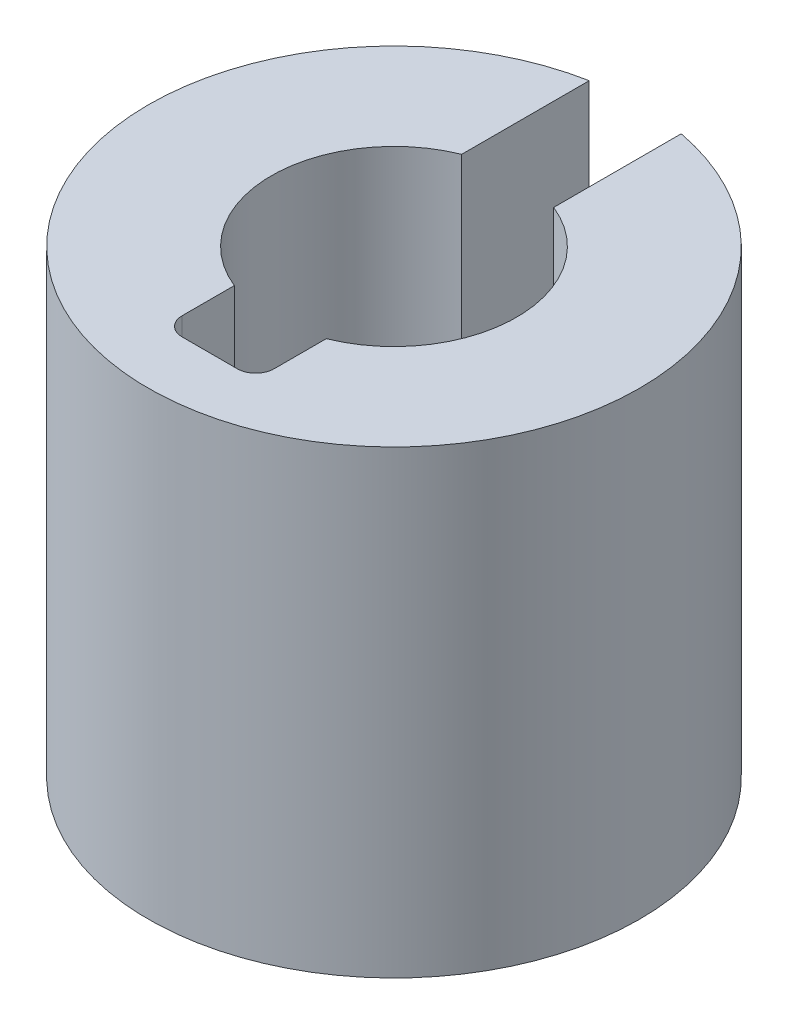
ISO-10303-21;
HEADER;
FILE_DESCRIPTION(('STEP AP214'),'2;1');
FILE_NAME('part.step','',(''),(''),'','','');
FILE_SCHEMA(('AUTOMOTIVE_DESIGN { 1 0 10303 214 1 1 1 1 }'));
ENDSEC;
DATA;
#1=APPLICATION_CONTEXT('core data for automotive mechanical design processes');
#2=APPLICATION_PROTOCOL_DEFINITION('international standard','automotive_design',2000,#1);
#3=PRODUCT_CONTEXT('',#1,'mechanical');
#4=PRODUCT('Part','Part','',(#3));
#5=PRODUCT_RELATED_PRODUCT_CATEGORY('part','',(#4));
#6=PRODUCT_DEFINITION_FORMATION('','',#4);
#7=PRODUCT_DEFINITION_CONTEXT('part definition',#1,'design');
#8=PRODUCT_DEFINITION('design','',#6,#7);
#9=PRODUCT_DEFINITION_SHAPE('','',#8);
#10=(LENGTH_UNIT() NAMED_UNIT(*) SI_UNIT(.MILLI.,.METRE.));
#11=(NAMED_UNIT(*) PLANE_ANGLE_UNIT() SI_UNIT($,.RADIAN.));
#12=(NAMED_UNIT(*) SI_UNIT($,.STERADIAN.) SOLID_ANGLE_UNIT());
#13=UNCERTAINTY_MEASURE_WITH_UNIT(LENGTH_MEASURE(1.E-05),#10,'distance_accuracy_value','');
#14=(GEOMETRIC_REPRESENTATION_CONTEXT(3) GLOBAL_UNCERTAINTY_ASSIGNED_CONTEXT((#13)) GLOBAL_UNIT_ASSIGNED_CONTEXT((#10,
#11,#12)) REPRESENTATION_CONTEXT('',''));
#15=CARTESIAN_POINT('',(0.,0.,0.));
#16=DIRECTION('',(0.,0.,1.));
#17=DIRECTION('',(1.,0.,0.));
#18=AXIS2_PLACEMENT_3D('',#15,#16,#17);
#19=CARTESIAN_POINT('',(0.,3.75,0.));
#20=DIRECTION('',(0.,-1.,0.));
#21=DIRECTION('',(0.,0.,-1.));
#22=AXIS2_PLACEMENT_3D('',#19,#20,#21);
#23=CYLINDRICAL_SURFACE('',#22,2.);
#24=CARTESIAN_POINT('',(0.,-3.75,0.));
#25=DIRECTION('',(0.,1.,0.));
#26=DIRECTION('',(0.,0.,1.));
#27=AXIS2_PLACEMENT_3D('',#24,#25,#26);
#28=CIRCLE('',#27,2.);
#29=CARTESIAN_POINT('',(0.75,-3.75,1.85404962177392));
#30=VERTEX_POINT('',#29);
#31=CARTESIAN_POINT('',(0.75,-3.75,-1.85404962177392));
#32=VERTEX_POINT('',#31);
#33=EDGE_CURVE('E147',#30,#32,#28,.T.);
#34=ORIENTED_EDGE('',*,*,#33,.F.);
#35=DIRECTION('',(0.,-1.,0.));
#36=VECTOR('',#35,1.);
#37=CARTESIAN_POINT('',(0.75,3.75,1.85404962177392));
#38=LINE('',#37,#36);
#39=CARTESIAN_POINT('',(0.75,3.75,1.85404962177392));
#40=VERTEX_POINT('',#39);
#41=EDGE_CURVE('E11',#40,#30,#38,.T.);
#42=ORIENTED_EDGE('',*,*,#41,.F.);
#43=CARTESIAN_POINT('',(0.,3.75,0.));
#44=DIRECTION('',(0.,1.,0.));
#45=DIRECTION('',(0.,0.,1.));
#46=AXIS2_PLACEMENT_3D('',#43,#44,#45);
#47=CIRCLE('',#46,2.);
#48=CARTESIAN_POINT('',(0.75,3.75,-1.85404962177392));
#49=VERTEX_POINT('',#48);
#50=EDGE_CURVE('E173',#40,#49,#47,.T.);
#51=ORIENTED_EDGE('',*,*,#50,.T.);
#52=DIRECTION('',(0.,-1.,0.));
#53=VECTOR('',#52,1.);
#54=CARTESIAN_POINT('',(0.75,3.75,-1.85404962177392));
#55=LINE('',#54,#53);
#56=EDGE_CURVE('E41',#49,#32,#55,.T.);
#57=ORIENTED_EDGE('',*,*,#56,.T.);
#58=EDGE_LOOP('',(#34,#42,#51,#57));
#59=FACE_BOUND('',#58,.T.);
#60=ADVANCED_FACE('F38',(#59),#23,.F.);
#61=CARTESIAN_POINT('',(0.75,3.75,2.705));
#62=DIRECTION('',(-1.,0.,0.));
#63=DIRECTION('',(0.,0.,1.));
#64=AXIS2_PLACEMENT_3D('',#61,#62,#63);
#65=PLANE('',#64);
#66=DIRECTION('',(0.,0.,-1.));
#67=VECTOR('',#66,1.);
#68=CARTESIAN_POINT('',(0.75,-3.75,2.705));
#69=LINE('',#68,#67);
#70=CARTESIAN_POINT('',(0.75,-3.75,2.705));
#71=VERTEX_POINT('',#70);
#72=EDGE_CURVE('E171',#71,#30,#69,.T.);
#73=ORIENTED_EDGE('',*,*,#72,.F.);
#74=DIRECTION('',(0.,-1.,0.));
#75=VECTOR('',#74,1.);
#76=CARTESIAN_POINT('',(0.75,3.75,2.705));
#77=LINE('',#76,#75);
#78=CARTESIAN_POINT('',(0.75,3.75,2.705));
#79=VERTEX_POINT('',#78);
#80=EDGE_CURVE('E47',#79,#71,#77,.T.);
#81=ORIENTED_EDGE('',*,*,#80,.F.);
#82=DIRECTION('',(0.,0.,-1.));
#83=VECTOR('',#82,1.);
#84=CARTESIAN_POINT('',(0.75,3.75,2.705));
#85=LINE('',#84,#83);
#86=EDGE_CURVE('E137',#79,#40,#85,.T.);
#87=ORIENTED_EDGE('',*,*,#86,.T.);
#88=ORIENTED_EDGE('',*,*,#41,.T.);
#89=EDGE_LOOP('',(#73,#81,#87,#88));
#90=FACE_BOUND('',#89,.T.);
#91=ADVANCED_FACE('F189',(#90),#65,.T.);
#92=CARTESIAN_POINT('',(0.45,3.75,2.705));
#93=DIRECTION('',(0.,-1.,0.));
#94=DIRECTION('',(0.,0.,-1.));
#95=AXIS2_PLACEMENT_3D('',#92,#93,#94);
#96=CYLINDRICAL_SURFACE('',#95,0.3);
#97=CARTESIAN_POINT('',(0.45,-3.75,2.705));
#98=DIRECTION('',(0.,1.,0.));
#99=DIRECTION('',(0.,0.,1.));
#100=AXIS2_PLACEMENT_3D('',#97,#98,#99);
#101=CIRCLE('',#100,0.3);
#102=CARTESIAN_POINT('',(0.45,-3.75,3.005));
#103=VERTEX_POINT('',#102);
#104=EDGE_CURVE('E124',#103,#71,#101,.T.);
#105=ORIENTED_EDGE('',*,*,#104,.F.);
#106=DIRECTION('',(0.,-1.,0.));
#107=VECTOR('',#106,1.);
#108=CARTESIAN_POINT('',(0.45,3.75,3.005));
#109=LINE('',#108,#107);
#110=CARTESIAN_POINT('',(0.45,3.75,3.005));
#111=VERTEX_POINT('',#110);
#112=EDGE_CURVE('E119',#111,#103,#109,.T.);
#113=ORIENTED_EDGE('',*,*,#112,.F.);
#114=CARTESIAN_POINT('',(0.45,3.75,2.705));
#115=DIRECTION('',(0.,1.,0.));
#116=DIRECTION('',(0.,0.,1.));
#117=AXIS2_PLACEMENT_3D('',#114,#115,#116);
#118=CIRCLE('',#117,0.3);
#119=EDGE_CURVE('E122',#111,#79,#118,.T.);
#120=ORIENTED_EDGE('',*,*,#119,.T.);
#121=ORIENTED_EDGE('',*,*,#80,.T.);
#122=EDGE_LOOP('',(#105,#113,#120,#121));
#123=FACE_BOUND('',#122,.T.);
#124=ADVANCED_FACE('F121',(#123),#96,.F.);
#125=CARTESIAN_POINT('',(-0.45,3.75,3.005));
#126=DIRECTION('',(0.,0.,-1.));
#127=DIRECTION('',(-1.,0.,0.));
#128=AXIS2_PLACEMENT_3D('',#125,#126,#127);
#129=PLANE('',#128);
#130=DIRECTION('',(1.,0.,0.));
#131=VECTOR('',#130,1.);
#132=CARTESIAN_POINT('',(-0.45,-3.75,3.005));
#133=LINE('',#132,#131);
#134=CARTESIAN_POINT('',(-0.45,-3.75,3.005));
#135=VERTEX_POINT('',#134);
#136=EDGE_CURVE('E168',#135,#103,#133,.T.);
#137=ORIENTED_EDGE('',*,*,#136,.F.);
#138=DIRECTION('',(0.,-1.,0.));
#139=VECTOR('',#138,1.);
#140=CARTESIAN_POINT('',(-0.45,3.75,3.005));
#141=LINE('',#140,#139);
#142=CARTESIAN_POINT('',(-0.45,3.75,3.005));
#143=VERTEX_POINT('',#142);
#144=EDGE_CURVE('E129',#143,#135,#141,.T.);
#145=ORIENTED_EDGE('',*,*,#144,.F.);
#146=DIRECTION('',(1.,0.,0.));
#147=VECTOR('',#146,1.);
#148=CARTESIAN_POINT('',(-0.45,3.75,3.005));
#149=LINE('',#148,#147);
#150=EDGE_CURVE('E135',#143,#111,#149,.T.);
#151=ORIENTED_EDGE('',*,*,#150,.T.);
#152=ORIENTED_EDGE('',*,*,#112,.T.);
#153=EDGE_LOOP('',(#137,#145,#151,#152));
#154=FACE_BOUND('',#153,.T.);
#155=ADVANCED_FACE('F139',(#154),#129,.T.);
#156=CARTESIAN_POINT('',(-0.45,3.75,2.705));
#157=DIRECTION('',(0.,-1.,0.));
#158=DIRECTION('',(0.,0.,-1.));
#159=AXIS2_PLACEMENT_3D('',#156,#157,#158);
#160=CYLINDRICAL_SURFACE('',#159,0.3);
#161=CARTESIAN_POINT('',(-0.45,-3.75,2.705));
#162=DIRECTION('',(0.,1.,0.));
#163=DIRECTION('',(0.,0.,1.));
#164=AXIS2_PLACEMENT_3D('',#161,#162,#163);
#165=CIRCLE('',#164,0.3);
#166=CARTESIAN_POINT('',(-0.75,-3.75,2.705));
#167=VERTEX_POINT('',#166);
#168=EDGE_CURVE('E165',#167,#135,#165,.T.);
#169=ORIENTED_EDGE('',*,*,#168,.F.);
#170=DIRECTION('',(0.,-1.,0.));
#171=VECTOR('',#170,1.);
#172=CARTESIAN_POINT('',(-0.75,3.75,2.705));
#173=LINE('',#172,#171);
#174=CARTESIAN_POINT('',(-0.75,3.75,2.705));
#175=VERTEX_POINT('',#174);
#176=EDGE_CURVE('E177',#175,#167,#173,.T.);
#177=ORIENTED_EDGE('',*,*,#176,.F.);
#178=CARTESIAN_POINT('',(-0.45,3.75,2.705));
#179=DIRECTION('',(0.,1.,0.));
#180=DIRECTION('',(0.,0.,1.));
#181=AXIS2_PLACEMENT_3D('',#178,#179,#180);
#182=CIRCLE('',#181,0.3);
#183=EDGE_CURVE('E140',#175,#143,#182,.T.);
#184=ORIENTED_EDGE('',*,*,#183,.T.);
#185=ORIENTED_EDGE('',*,*,#144,.T.);
#186=EDGE_LOOP('',(#169,#177,#184,#185));
#187=FACE_BOUND('',#186,.T.);
#188=ADVANCED_FACE('F202',(#187),#160,.F.);
#189=CARTESIAN_POINT('',(-0.75,3.75,1.85404962177392));
#190=DIRECTION('',(1.,0.,0.));
#191=DIRECTION('',(0.,0.,-1.));
#192=AXIS2_PLACEMENT_3D('',#189,#190,#191);
#193=PLANE('',#192);
#194=DIRECTION('',(0.,0.,1.));
#195=VECTOR('',#194,1.);
#196=CARTESIAN_POINT('',(-0.75,-3.75,1.85404962177392));
#197=LINE('',#196,#195);
#198=CARTESIAN_POINT('',(-0.75,-3.75,1.85404962177392));
#199=VERTEX_POINT('',#198);
#200=EDGE_CURVE('E162',#199,#167,#197,.T.);
#201=ORIENTED_EDGE('',*,*,#200,.F.);
#202=DIRECTION('',(0.,-1.,0.));
#203=VECTOR('',#202,1.);
#204=CARTESIAN_POINT('',(-0.75,3.75,1.85404962177392));
#205=LINE('',#204,#203);
#206=CARTESIAN_POINT('',(-0.75,3.75,1.85404962177392));
#207=VERTEX_POINT('',#206);
#208=EDGE_CURVE('E179',#207,#199,#205,.T.);
#209=ORIENTED_EDGE('',*,*,#208,.F.);
#210=DIRECTION('',(0.,0.,1.));
#211=VECTOR('',#210,1.);
#212=CARTESIAN_POINT('',(-0.75,3.75,1.85404962177392));
#213=LINE('',#212,#211);
#214=EDGE_CURVE('E142',#207,#175,#213,.T.);
#215=ORIENTED_EDGE('',*,*,#214,.T.);
#216=ORIENTED_EDGE('',*,*,#176,.T.);
#217=EDGE_LOOP('',(#201,#209,#215,#216));
#218=FACE_BOUND('',#217,.T.);
#219=ADVANCED_FACE('F205',(#218),#193,.T.);
#220=CARTESIAN_POINT('',(0.,3.75,0.));
#221=DIRECTION('',(0.,-1.,0.));
#222=DIRECTION('',(0.,0.,-1.));
#223=AXIS2_PLACEMENT_3D('',#220,#221,#222);
#224=CYLINDRICAL_SURFACE('',#223,2.);
#225=CARTESIAN_POINT('',(0.,-3.75,0.));
#226=DIRECTION('',(0.,1.,0.));
#227=DIRECTION('',(0.,0.,1.));
#228=AXIS2_PLACEMENT_3D('',#225,#226,#227);
#229=CIRCLE('',#228,2.);
#230=CARTESIAN_POINT('',(-0.75,-3.75,-1.85404962177392));
#231=VERTEX_POINT('',#230);
#232=EDGE_CURVE('E159',#231,#199,#229,.T.);
#233=ORIENTED_EDGE('',*,*,#232,.F.);
#234=DIRECTION('',(0.,-1.,0.));
#235=VECTOR('',#234,1.);
#236=CARTESIAN_POINT('',(-0.75,3.75,-1.85404962177392));
#237=LINE('',#236,#235);
#238=CARTESIAN_POINT('',(-0.75,3.75,-1.85404962177392));
#239=VERTEX_POINT('',#238);
#240=EDGE_CURVE('E181',#239,#231,#237,.T.);
#241=ORIENTED_EDGE('',*,*,#240,.F.);
#242=CARTESIAN_POINT('',(0.,3.75,0.));
#243=DIRECTION('',(0.,1.,0.));
#244=DIRECTION('',(0.,0.,1.));
#245=AXIS2_PLACEMENT_3D('',#242,#243,#244);
#246=CIRCLE('',#245,2.);
#247=EDGE_CURVE('E304',#239,#207,#246,.T.);
#248=ORIENTED_EDGE('',*,*,#247,.T.);
#249=ORIENTED_EDGE('',*,*,#208,.T.);
#250=EDGE_LOOP('',(#233,#241,#248,#249));
#251=FACE_BOUND('',#250,.T.);
#252=ADVANCED_FACE('F209',(#251),#224,.F.);
#253=CARTESIAN_POINT('',(-0.75,3.75,-3.9341485737069));
#254=DIRECTION('',(1.,0.,0.));
#255=DIRECTION('',(0.,0.,-1.));
#256=AXIS2_PLACEMENT_3D('',#253,#254,#255);
#257=PLANE('',#256);
#258=DIRECTION('',(0.,0.,1.));
#259=VECTOR('',#258,1.);
#260=CARTESIAN_POINT('',(-0.75,-3.75,-3.9341485737069));
#261=LINE('',#260,#259);
#262=CARTESIAN_POINT('',(-0.75,-3.75,-3.9341485737069));
#263=VERTEX_POINT('',#262);
#264=EDGE_CURVE('E156',#263,#231,#261,.T.);
#265=ORIENTED_EDGE('',*,*,#264,.F.);
#266=DIRECTION('',(0.,-1.,0.));
#267=VECTOR('',#266,1.);
#268=CARTESIAN_POINT('',(-0.75,3.75,-3.9341485737069));
#269=LINE('',#268,#267);
#270=CARTESIAN_POINT('',(-0.75,3.75,-3.9341485737069));
#271=VERTEX_POINT('',#270);
#272=EDGE_CURVE('E183',#271,#263,#269,.T.);
#273=ORIENTED_EDGE('',*,*,#272,.F.);
#274=DIRECTION('',(0.,0.,1.));
#275=VECTOR('',#274,1.);
#276=CARTESIAN_POINT('',(-0.75,3.75,-3.9341485737069));
#277=LINE('',#276,#275);
#278=EDGE_CURVE('E300',#271,#239,#277,.T.);
#279=ORIENTED_EDGE('',*,*,#278,.T.);
#280=ORIENTED_EDGE('',*,*,#240,.T.);
#281=EDGE_LOOP('',(#265,#273,#279,#280));
#282=FACE_BOUND('',#281,.T.);
#283=ADVANCED_FACE('F213',(#282),#257,.T.);
#284=CARTESIAN_POINT('',(0.,3.75,0.));
#285=DIRECTION('',(0.,-1.,0.));
#286=DIRECTION('',(0.,0.,-1.));
#287=AXIS2_PLACEMENT_3D('',#284,#285,#286);
#288=CYLINDRICAL_SURFACE('',#287,4.005);
#289=CARTESIAN_POINT('',(0.,-3.75,0.));
#290=DIRECTION('',(0.,-1.,0.));
#291=DIRECTION('',(0.,0.,-1.));
#292=AXIS2_PLACEMENT_3D('',#289,#290,#291);
#293=CIRCLE('',#292,4.005);
#294=CARTESIAN_POINT('',(0.75,-3.75,-3.9341485737069));
#295=VERTEX_POINT('',#294);
#296=EDGE_CURVE('E153',#295,#263,#293,.T.);
#297=ORIENTED_EDGE('',*,*,#296,.F.);
#298=DIRECTION('',(0.,-1.,0.));
#299=VECTOR('',#298,1.);
#300=CARTESIAN_POINT('',(0.75,3.75,-3.9341485737069));
#301=LINE('',#300,#299);
#302=CARTESIAN_POINT('',(0.75,3.75,-3.9341485737069));
#303=VERTEX_POINT('',#302);
#304=EDGE_CURVE('E184',#303,#295,#301,.T.);
#305=ORIENTED_EDGE('',*,*,#304,.F.);
#306=CARTESIAN_POINT('',(0.,3.75,0.));
#307=DIRECTION('',(0.,-1.,0.));
#308=DIRECTION('',(0.,0.,-1.));
#309=AXIS2_PLACEMENT_3D('',#306,#307,#308);
#310=CIRCLE('',#309,4.005);
#311=EDGE_CURVE('E311',#303,#271,#310,.T.);
#312=ORIENTED_EDGE('',*,*,#311,.T.);
#313=ORIENTED_EDGE('',*,*,#272,.T.);
#314=EDGE_LOOP('',(#297,#305,#312,#313));
#315=FACE_BOUND('',#314,.T.);
#316=ADVANCED_FACE('F217',(#315),#288,.T.);
#317=CARTESIAN_POINT('',(0.75,3.75,-1.85404962177392));
#318=DIRECTION('',(-1.,0.,0.));
#319=DIRECTION('',(0.,0.,1.));
#320=AXIS2_PLACEMENT_3D('',#317,#318,#319);
#321=PLANE('',#320);
#322=DIRECTION('',(0.,0.,-1.));
#323=VECTOR('',#322,1.);
#324=CARTESIAN_POINT('',(0.75,-3.75,-1.85404962177392));
#325=LINE('',#324,#323);
#326=EDGE_CURVE('E150',#32,#295,#325,.T.);
#327=ORIENTED_EDGE('',*,*,#326,.F.);
#328=ORIENTED_EDGE('',*,*,#56,.F.);
#329=DIRECTION('',(0.,0.,-1.));
#330=VECTOR('',#329,1.);
#331=CARTESIAN_POINT('',(0.75,3.75,-1.85404962177392));
#332=LINE('',#331,#330);
#333=EDGE_CURVE('E313',#49,#303,#332,.T.);
#334=ORIENTED_EDGE('',*,*,#333,.T.);
#335=ORIENTED_EDGE('',*,*,#304,.T.);
#336=EDGE_LOOP('',(#327,#328,#334,#335));
#337=FACE_BOUND('',#336,.T.);
#338=ADVANCED_FACE('F186',(#337),#321,.T.);
#339=CARTESIAN_POINT('',(0.,3.75,0.));
#340=DIRECTION('',(0.,1.,0.));
#341=DIRECTION('',(0.,0.,1.));
#342=AXIS2_PLACEMENT_3D('',#339,#340,#341);
#343=PLANE('',#342);
#344=ORIENTED_EDGE('',*,*,#50,.F.);
#345=ORIENTED_EDGE('',*,*,#86,.F.);
#346=ORIENTED_EDGE('',*,*,#119,.F.);
#347=ORIENTED_EDGE('',*,*,#150,.F.);
#348=ORIENTED_EDGE('',*,*,#183,.F.);
#349=ORIENTED_EDGE('',*,*,#214,.F.);
#350=ORIENTED_EDGE('',*,*,#247,.F.);
#351=ORIENTED_EDGE('',*,*,#278,.F.);
#352=ORIENTED_EDGE('',*,*,#311,.F.);
#353=ORIENTED_EDGE('',*,*,#333,.F.);
#354=EDGE_LOOP('',(#344,#345,#346,#347,#348,#349,#350,#351,#352,#353));
#355=FACE_BOUND('',#354,.T.);
#356=ADVANCED_FACE('F133',(#355),#343,.T.);
#357=CARTESIAN_POINT('',(0.,-3.75,0.));
#358=DIRECTION('',(0.,1.,0.));
#359=DIRECTION('',(0.,0.,1.));
#360=AXIS2_PLACEMENT_3D('',#357,#358,#359);
#361=PLANE('',#360);
#362=ORIENTED_EDGE('',*,*,#33,.T.);
#363=ORIENTED_EDGE('',*,*,#326,.T.);
#364=ORIENTED_EDGE('',*,*,#296,.T.);
#365=ORIENTED_EDGE('',*,*,#264,.T.);
#366=ORIENTED_EDGE('',*,*,#232,.T.);
#367=ORIENTED_EDGE('',*,*,#200,.T.);
#368=ORIENTED_EDGE('',*,*,#168,.T.);
#369=ORIENTED_EDGE('',*,*,#136,.T.);
#370=ORIENTED_EDGE('',*,*,#104,.T.);
#371=ORIENTED_EDGE('',*,*,#72,.T.);
#372=EDGE_LOOP('',(#362,#363,#364,#365,#366,#367,#368,#369,#370,#371));
#373=FACE_BOUND('',#372,.T.);
#374=ADVANCED_FACE('F188',(#373),#361,.F.);
#375=CLOSED_SHELL('',(#60,#91,#124,#155,#188,#219,#252,#283,#316,#338,#356,#374));
#376=MANIFOLD_SOLID_BREP('B2',#375);
#377=ADVANCED_BREP_SHAPE_REPRESENTATION('',(#18,#376),#14);
#378=SHAPE_DEFINITION_REPRESENTATION(#9,#377);
ENDSEC;
END-ISO-10303-21;
